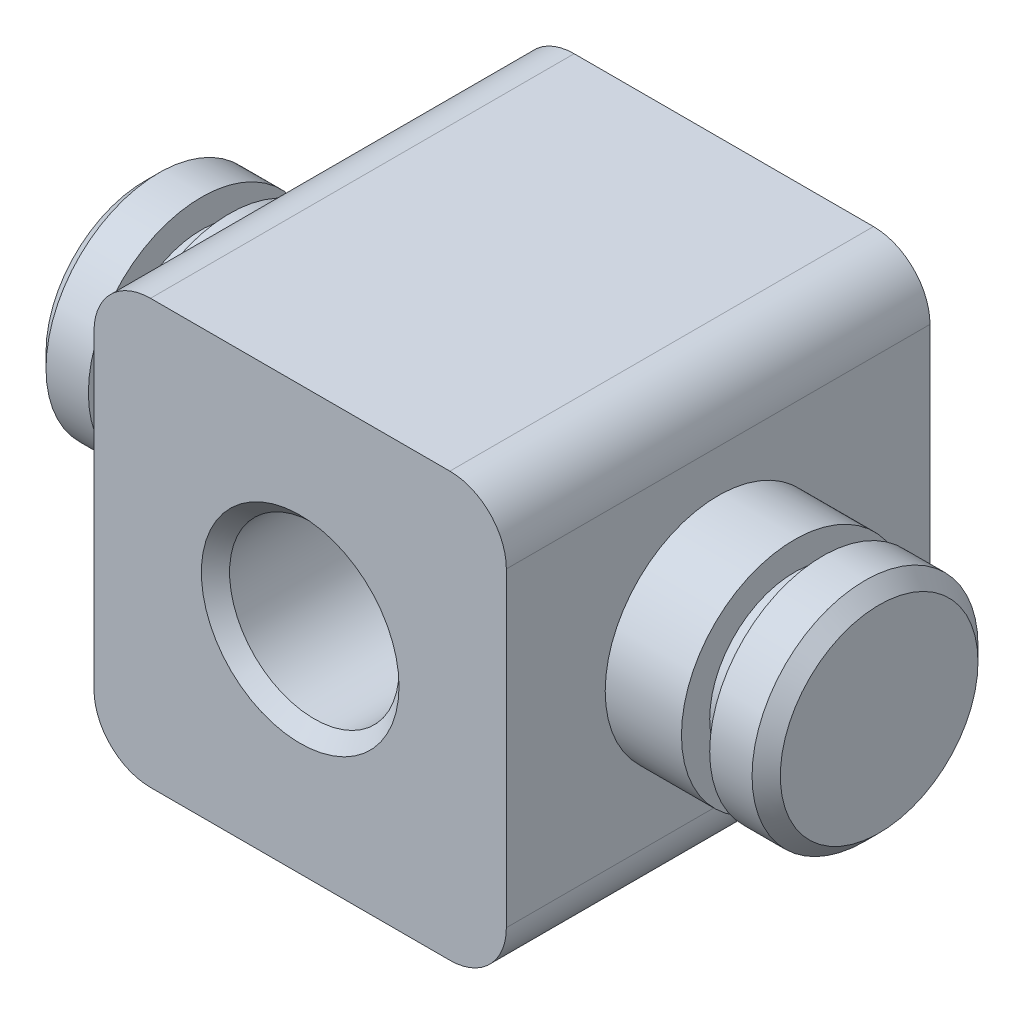
ISO-10303-21;
HEADER;
FILE_DESCRIPTION(('STEP AP214'),'2;1');
FILE_NAME('part.step','',(''),(''),'','','');
FILE_SCHEMA(('AUTOMOTIVE_DESIGN { 1 0 10303 214 1 1 1 1 }'));
ENDSEC;
DATA;
#1=APPLICATION_CONTEXT('core data for automotive mechanical design processes');
#2=APPLICATION_PROTOCOL_DEFINITION('international standard','automotive_design',2000,#1);
#3=PRODUCT_CONTEXT('',#1,'mechanical');
#4=PRODUCT('Part','Part','',(#3));
#5=PRODUCT_RELATED_PRODUCT_CATEGORY('part','',(#4));
#6=PRODUCT_DEFINITION_FORMATION('','',#4);
#7=PRODUCT_DEFINITION_CONTEXT('part definition',#1,'design');
#8=PRODUCT_DEFINITION('design','',#6,#7);
#9=PRODUCT_DEFINITION_SHAPE('','',#8);
#10=(LENGTH_UNIT() NAMED_UNIT(*) SI_UNIT(.MILLI.,.METRE.));
#11=(NAMED_UNIT(*) PLANE_ANGLE_UNIT() SI_UNIT($,.RADIAN.));
#12=(NAMED_UNIT(*) SI_UNIT($,.STERADIAN.) SOLID_ANGLE_UNIT());
#13=UNCERTAINTY_MEASURE_WITH_UNIT(LENGTH_MEASURE(1.E-05),#10,'distance_accuracy_value','');
#14=(GEOMETRIC_REPRESENTATION_CONTEXT(3) GLOBAL_UNCERTAINTY_ASSIGNED_CONTEXT((#13)) GLOBAL_UNIT_ASSIGNED_CONTEXT((#10,
#11,#12)) REPRESENTATION_CONTEXT('',''));
#15=CARTESIAN_POINT('',(0.,0.,0.));
#16=DIRECTION('',(0.,0.,1.));
#17=DIRECTION('',(1.,0.,0.));
#18=AXIS2_PLACEMENT_3D('',#15,#16,#17);
#19=CARTESIAN_POINT('',(5.3,-5.5,15.));
#20=DIRECTION('',(0.,0.,1.));
#21=DIRECTION('',(1.,0.,0.));
#22=AXIS2_PLACEMENT_3D('',#19,#20,#21);
#23=PLANE('',#22);
#24=CARTESIAN_POINT('',(0.,0.,15.));
#25=DIRECTION('',(0.,0.,1.));
#26=DIRECTION('',(1.,0.,0.));
#27=AXIS2_PLACEMENT_3D('',#24,#25,#26);
#28=CIRCLE('',#27,3.50000000000001);
#29=CARTESIAN_POINT('',(3.50000000000001,0.,15.));
#30=VERTEX_POINT('',#29);
#31=EDGE_CURVE('E11',#30,#30,#28,.F.);
#32=ORIENTED_EDGE('',*,*,#31,.T.);
#33=EDGE_LOOP('',(#32));
#34=FACE_BOUND('',#33,.T.);
#35=CARTESIAN_POINT('',(5.3,-5.5,15.));
#36=DIRECTION('',(0.,0.,1.));
#37=DIRECTION('',(1.,0.,0.));
#38=AXIS2_PLACEMENT_3D('',#35,#36,#37);
#39=CIRCLE('',#38,2.);
#40=CARTESIAN_POINT('',(5.29999999999999,-7.5,15.));
#41=VERTEX_POINT('',#40);
#42=CARTESIAN_POINT('',(7.3,-5.49999999999999,15.));
#43=VERTEX_POINT('',#42);
#44=EDGE_CURVE('E167',#41,#43,#39,.T.);
#45=ORIENTED_EDGE('',*,*,#44,.T.);
#46=DIRECTION('',(0.,1.,0.));
#47=VECTOR('',#46,1.);
#48=CARTESIAN_POINT('',(7.3,-5.49999999999999,15.));
#49=LINE('',#48,#47);
#50=CARTESIAN_POINT('',(7.3,5.49999999999999,15.));
#51=VERTEX_POINT('',#50);
#52=EDGE_CURVE('E104',#43,#51,#49,.T.);
#53=ORIENTED_EDGE('',*,*,#52,.T.);
#54=CARTESIAN_POINT('',(5.3,5.5,15.));
#55=DIRECTION('',(0.,0.,1.));
#56=DIRECTION('',(-1.,0.,0.));
#57=AXIS2_PLACEMENT_3D('',#54,#55,#56);
#58=CIRCLE('',#57,2.);
#59=CARTESIAN_POINT('',(5.29999999999999,7.5,15.));
#60=VERTEX_POINT('',#59);
#61=EDGE_CURVE('E353',#51,#60,#58,.T.);
#62=ORIENTED_EDGE('',*,*,#61,.T.);
#63=DIRECTION('',(-1.,0.,0.));
#64=VECTOR('',#63,1.);
#65=CARTESIAN_POINT('',(-5.29999999999999,7.5,15.));
#66=LINE('',#65,#64);
#67=CARTESIAN_POINT('',(-5.29999999999999,7.5,15.));
#68=VERTEX_POINT('',#67);
#69=EDGE_CURVE('E356',#60,#68,#66,.T.);
#70=ORIENTED_EDGE('',*,*,#69,.T.);
#71=CARTESIAN_POINT('',(-5.3,5.5,15.));
#72=DIRECTION('',(0.,0.,1.));
#73=DIRECTION('',(-1.,0.,0.));
#74=AXIS2_PLACEMENT_3D('',#71,#72,#73);
#75=CIRCLE('',#74,2.);
#76=CARTESIAN_POINT('',(-7.3,5.49999999999999,15.));
#77=VERTEX_POINT('',#76);
#78=EDGE_CURVE('E122',#68,#77,#75,.T.);
#79=ORIENTED_EDGE('',*,*,#78,.T.);
#80=DIRECTION('',(0.,-1.,0.));
#81=VECTOR('',#80,1.);
#82=CARTESIAN_POINT('',(-7.3,-5.49999999999999,15.));
#83=LINE('',#82,#81);
#84=CARTESIAN_POINT('',(-7.3,-5.5,15.));
#85=VERTEX_POINT('',#84);
#86=EDGE_CURVE('E117',#77,#85,#83,.T.);
#87=ORIENTED_EDGE('',*,*,#86,.T.);
#88=CARTESIAN_POINT('',(-5.3,-5.5,15.));
#89=DIRECTION('',(0.,0.,1.));
#90=DIRECTION('',(-1.,0.,0.));
#91=AXIS2_PLACEMENT_3D('',#88,#89,#90);
#92=CIRCLE('',#91,2.);
#93=CARTESIAN_POINT('',(-5.29999999999999,-7.5,15.));
#94=VERTEX_POINT('',#93);
#95=EDGE_CURVE('E120',#85,#94,#92,.T.);
#96=ORIENTED_EDGE('',*,*,#95,.T.);
#97=DIRECTION('',(1.,0.,0.));
#98=VECTOR('',#97,1.);
#99=CARTESIAN_POINT('',(-5.29999999999999,-7.5,15.));
#100=LINE('',#99,#98);
#101=EDGE_CURVE('E60',#94,#41,#100,.T.);
#102=ORIENTED_EDGE('',*,*,#101,.T.);
#103=EDGE_LOOP('',(#45,#53,#62,#70,#79,#87,#96,#102));
#104=FACE_BOUND('',#103,.T.);
#105=ADVANCED_FACE('F41',(#34,#104),#23,.T.);
#106=CARTESIAN_POINT('',(5.3,-5.5,0.));
#107=DIRECTION('',(0.,0.,1.));
#108=DIRECTION('',(1.,0.,0.));
#109=AXIS2_PLACEMENT_3D('',#106,#107,#108);
#110=PLANE('',#109);
#111=CARTESIAN_POINT('',(0.,0.,0.));
#112=DIRECTION('',(0.,0.,1.));
#113=DIRECTION('',(1.,0.,0.));
#114=AXIS2_PLACEMENT_3D('',#111,#112,#113);
#115=CIRCLE('',#114,3.5);
#116=CARTESIAN_POINT('',(3.49999999999999,0.,0.));
#117=VERTEX_POINT('',#116);
#118=EDGE_CURVE('E210',#117,#117,#115,.T.);
#119=ORIENTED_EDGE('',*,*,#118,.T.);
#120=EDGE_LOOP('',(#119));
#121=FACE_BOUND('',#120,.T.);
#122=CARTESIAN_POINT('',(5.3,-5.5,0.));
#123=DIRECTION('',(0.,0.,1.));
#124=DIRECTION('',(1.,0.,0.));
#125=AXIS2_PLACEMENT_3D('',#122,#123,#124);
#126=CIRCLE('',#125,2.);
#127=CARTESIAN_POINT('',(5.29999999999999,-7.5,0.));
#128=VERTEX_POINT('',#127);
#129=CARTESIAN_POINT('',(7.3,-5.49999999999999,0.));
#130=VERTEX_POINT('',#129);
#131=EDGE_CURVE('E144',#128,#130,#126,.T.);
#132=ORIENTED_EDGE('',*,*,#131,.F.);
#133=DIRECTION('',(1.,0.,0.));
#134=VECTOR('',#133,1.);
#135=CARTESIAN_POINT('',(-5.29999999999999,-7.5,0.));
#136=LINE('',#135,#134);
#137=CARTESIAN_POINT('',(-5.29999999999999,-7.5,0.));
#138=VERTEX_POINT('',#137);
#139=EDGE_CURVE('E95',#138,#128,#136,.T.);
#140=ORIENTED_EDGE('',*,*,#139,.F.);
#141=CARTESIAN_POINT('',(-5.3,-5.5,0.));
#142=DIRECTION('',(0.,0.,1.));
#143=DIRECTION('',(-1.,0.,0.));
#144=AXIS2_PLACEMENT_3D('',#141,#142,#143);
#145=CIRCLE('',#144,2.);
#146=CARTESIAN_POINT('',(-7.3,-5.5,0.));
#147=VERTEX_POINT('',#146);
#148=EDGE_CURVE('E89',#147,#138,#145,.T.);
#149=ORIENTED_EDGE('',*,*,#148,.F.);
#150=DIRECTION('',(0.,-1.,0.));
#151=VECTOR('',#150,1.);
#152=CARTESIAN_POINT('',(-7.3,-5.49999999999999,0.));
#153=LINE('',#152,#151);
#154=CARTESIAN_POINT('',(-7.3,5.49999999999999,0.));
#155=VERTEX_POINT('',#154);
#156=EDGE_CURVE('E131',#155,#147,#153,.T.);
#157=ORIENTED_EDGE('',*,*,#156,.F.);
#158=CARTESIAN_POINT('',(-5.3,5.5,0.));
#159=DIRECTION('',(0.,0.,1.));
#160=DIRECTION('',(-1.,0.,0.));
#161=AXIS2_PLACEMENT_3D('',#158,#159,#160);
#162=CIRCLE('',#161,2.);
#163=CARTESIAN_POINT('',(-5.29999999999999,7.5,0.));
#164=VERTEX_POINT('',#163);
#165=EDGE_CURVE('E158',#164,#155,#162,.T.);
#166=ORIENTED_EDGE('',*,*,#165,.F.);
#167=DIRECTION('',(-1.,0.,0.));
#168=VECTOR('',#167,1.);
#169=CARTESIAN_POINT('',(-5.29999999999999,7.5,0.));
#170=LINE('',#169,#168);
#171=CARTESIAN_POINT('',(5.29999999999999,7.5,0.));
#172=VERTEX_POINT('',#171);
#173=EDGE_CURVE('E155',#172,#164,#170,.T.);
#174=ORIENTED_EDGE('',*,*,#173,.F.);
#175=CARTESIAN_POINT('',(5.3,5.5,0.));
#176=DIRECTION('',(0.,0.,1.));
#177=DIRECTION('',(-1.,0.,0.));
#178=AXIS2_PLACEMENT_3D('',#175,#176,#177);
#179=CIRCLE('',#178,2.);
#180=CARTESIAN_POINT('',(7.3,5.49999999999999,0.));
#181=VERTEX_POINT('',#180);
#182=EDGE_CURVE('E152',#181,#172,#179,.T.);
#183=ORIENTED_EDGE('',*,*,#182,.F.);
#184=DIRECTION('',(0.,1.,0.));
#185=VECTOR('',#184,1.);
#186=CARTESIAN_POINT('',(7.3,-5.49999999999999,0.));
#187=LINE('',#186,#185);
#188=EDGE_CURVE('E148',#130,#181,#187,.T.);
#189=ORIENTED_EDGE('',*,*,#188,.F.);
#190=EDGE_LOOP('',(#132,#140,#149,#157,#166,#174,#183,#189));
#191=FACE_BOUND('',#190,.T.);
#192=ADVANCED_FACE('F230',(#121,#191),#110,.F.);
#193=CARTESIAN_POINT('',(5.3,-5.5,15.));
#194=DIRECTION('',(0.,0.,-1.));
#195=DIRECTION('',(-1.,0.,0.));
#196=AXIS2_PLACEMENT_3D('',#193,#194,#195);
#197=CYLINDRICAL_SURFACE('',#196,2.);
#198=ORIENTED_EDGE('',*,*,#131,.T.);
#199=DIRECTION('',(0.,0.,-1.));
#200=VECTOR('',#199,1.);
#201=CARTESIAN_POINT('',(7.3,-5.49999999999999,15.));
#202=LINE('',#201,#200);
#203=EDGE_CURVE('E186',#43,#130,#202,.T.);
#204=ORIENTED_EDGE('',*,*,#203,.F.);
#205=ORIENTED_EDGE('',*,*,#44,.F.);
#206=DIRECTION('',(0.,0.,-1.));
#207=VECTOR('',#206,1.);
#208=CARTESIAN_POINT('',(5.29999999999999,-7.5,15.));
#209=LINE('',#208,#207);
#210=EDGE_CURVE('E140',#41,#128,#209,.T.);
#211=ORIENTED_EDGE('',*,*,#210,.T.);
#212=EDGE_LOOP('',(#198,#204,#205,#211));
#213=FACE_BOUND('',#212,.T.);
#214=ADVANCED_FACE('F233',(#213),#197,.T.);
#215=CARTESIAN_POINT('',(7.3,-5.49999999999999,15.));
#216=DIRECTION('',(-1.,0.,0.));
#217=DIRECTION('',(0.,0.,1.));
#218=AXIS2_PLACEMENT_3D('',#215,#216,#217);
#219=PLANE('',#218);
#220=CARTESIAN_POINT('',(7.3,0.,7.5));
#221=DIRECTION('',(-1.,0.,0.));
#222=DIRECTION('',(0.,0.,1.));
#223=AXIS2_PLACEMENT_3D('',#220,#221,#222);
#224=CIRCLE('',#223,4.);
#225=CARTESIAN_POINT('',(7.3,0.,11.5));
#226=VERTEX_POINT('',#225);
#227=EDGE_CURVE('E327',#226,#226,#224,.T.);
#228=ORIENTED_EDGE('',*,*,#227,.T.);
#229=EDGE_LOOP('',(#228));
#230=FACE_BOUND('',#229,.T.);
#231=ORIENTED_EDGE('',*,*,#188,.T.);
#232=DIRECTION('',(0.,0.,-1.));
#233=VECTOR('',#232,1.);
#234=CARTESIAN_POINT('',(7.3,5.49999999999999,15.));
#235=LINE('',#234,#233);
#236=EDGE_CURVE('E182',#51,#181,#235,.T.);
#237=ORIENTED_EDGE('',*,*,#236,.F.);
#238=ORIENTED_EDGE('',*,*,#52,.F.);
#239=ORIENTED_EDGE('',*,*,#203,.T.);
#240=EDGE_LOOP('',(#231,#237,#238,#239));
#241=FACE_BOUND('',#240,.T.);
#242=ADVANCED_FACE('F371',(#230,#241),#219,.F.);
#243=CARTESIAN_POINT('',(5.3,5.5,15.));
#244=DIRECTION('',(0.,0.,-1.));
#245=DIRECTION('',(-1.,0.,0.));
#246=AXIS2_PLACEMENT_3D('',#243,#244,#245);
#247=CYLINDRICAL_SURFACE('',#246,2.);
#248=ORIENTED_EDGE('',*,*,#182,.T.);
#249=DIRECTION('',(0.,0.,-1.));
#250=VECTOR('',#249,1.);
#251=CARTESIAN_POINT('',(5.29999999999999,7.5,15.));
#252=LINE('',#251,#250);
#253=EDGE_CURVE('E178',#60,#172,#252,.T.);
#254=ORIENTED_EDGE('',*,*,#253,.F.);
#255=ORIENTED_EDGE('',*,*,#61,.F.);
#256=ORIENTED_EDGE('',*,*,#236,.T.);
#257=EDGE_LOOP('',(#248,#254,#255,#256));
#258=FACE_BOUND('',#257,.T.);
#259=ADVANCED_FACE('F370',(#258),#247,.T.);
#260=CARTESIAN_POINT('',(-5.29999999999999,7.5,15.));
#261=DIRECTION('',(0.,-1.,0.));
#262=DIRECTION('',(0.,0.,-1.));
#263=AXIS2_PLACEMENT_3D('',#260,#261,#262);
#264=PLANE('',#263);
#265=ORIENTED_EDGE('',*,*,#173,.T.);
#266=DIRECTION('',(0.,0.,-1.));
#267=VECTOR('',#266,1.);
#268=CARTESIAN_POINT('',(-5.29999999999999,7.5,15.));
#269=LINE('',#268,#267);
#270=EDGE_CURVE('E174',#68,#164,#269,.T.);
#271=ORIENTED_EDGE('',*,*,#270,.F.);
#272=ORIENTED_EDGE('',*,*,#69,.F.);
#273=ORIENTED_EDGE('',*,*,#253,.T.);
#274=EDGE_LOOP('',(#265,#271,#272,#273));
#275=FACE_BOUND('',#274,.T.);
#276=ADVANCED_FACE('F364',(#275),#264,.F.);
#277=CARTESIAN_POINT('',(-5.3,5.5,15.));
#278=DIRECTION('',(0.,0.,-1.));
#279=DIRECTION('',(-1.,0.,0.));
#280=AXIS2_PLACEMENT_3D('',#277,#278,#279);
#281=CYLINDRICAL_SURFACE('',#280,2.);
#282=ORIENTED_EDGE('',*,*,#165,.T.);
#283=DIRECTION('',(0.,0.,-1.));
#284=VECTOR('',#283,1.);
#285=CARTESIAN_POINT('',(-7.3,5.49999999999999,15.));
#286=LINE('',#285,#284);
#287=EDGE_CURVE('E133',#77,#155,#286,.T.);
#288=ORIENTED_EDGE('',*,*,#287,.F.);
#289=ORIENTED_EDGE('',*,*,#78,.F.);
#290=ORIENTED_EDGE('',*,*,#270,.T.);
#291=EDGE_LOOP('',(#282,#288,#289,#290));
#292=FACE_BOUND('',#291,.T.);
#293=ADVANCED_FACE('F368',(#292),#281,.T.);
#294=CARTESIAN_POINT('',(-7.3,-5.49999999999999,15.));
#295=DIRECTION('',(1.,0.,0.));
#296=DIRECTION('',(0.,0.,-1.));
#297=AXIS2_PLACEMENT_3D('',#294,#295,#296);
#298=PLANE('',#297);
#299=CARTESIAN_POINT('',(-7.3,0.,7.5));
#300=DIRECTION('',(1.,0.,0.));
#301=DIRECTION('',(0.,0.,-1.));
#302=AXIS2_PLACEMENT_3D('',#299,#300,#301);
#303=CIRCLE('',#302,4.);
#304=CARTESIAN_POINT('',(-7.3,0.,3.5));
#305=VERTEX_POINT('',#304);
#306=EDGE_CURVE('E189',#305,#305,#303,.F.);
#307=ORIENTED_EDGE('',*,*,#306,.F.);
#308=EDGE_LOOP('',(#307));
#309=FACE_BOUND('',#308,.T.);
#310=ORIENTED_EDGE('',*,*,#156,.T.);
#311=DIRECTION('',(0.,0.,-1.));
#312=VECTOR('',#311,1.);
#313=CARTESIAN_POINT('',(-7.3,-5.5,15.));
#314=LINE('',#313,#312);
#315=EDGE_CURVE('E128',#85,#147,#314,.T.);
#316=ORIENTED_EDGE('',*,*,#315,.F.);
#317=ORIENTED_EDGE('',*,*,#86,.F.);
#318=ORIENTED_EDGE('',*,*,#287,.T.);
#319=EDGE_LOOP('',(#310,#316,#317,#318));
#320=FACE_BOUND('',#319,.T.);
#321=ADVANCED_FACE('F129',(#309,#320),#298,.F.);
#322=CARTESIAN_POINT('',(-5.3,-5.5,15.));
#323=DIRECTION('',(0.,0.,-1.));
#324=DIRECTION('',(-1.,0.,0.));
#325=AXIS2_PLACEMENT_3D('',#322,#323,#324);
#326=CYLINDRICAL_SURFACE('',#325,2.);
#327=ORIENTED_EDGE('',*,*,#148,.T.);
#328=DIRECTION('',(0.,0.,-1.));
#329=VECTOR('',#328,1.);
#330=CARTESIAN_POINT('',(-5.29999999999999,-7.5,15.));
#331=LINE('',#330,#329);
#332=EDGE_CURVE('E134',#94,#138,#331,.T.);
#333=ORIENTED_EDGE('',*,*,#332,.F.);
#334=ORIENTED_EDGE('',*,*,#95,.F.);
#335=ORIENTED_EDGE('',*,*,#315,.T.);
#336=EDGE_LOOP('',(#327,#333,#334,#335));
#337=FACE_BOUND('',#336,.T.);
#338=ADVANCED_FACE('F136',(#337),#326,.T.);
#339=CARTESIAN_POINT('',(-5.29999999999999,-7.5,15.));
#340=DIRECTION('',(0.,1.,0.));
#341=DIRECTION('',(0.,0.,1.));
#342=AXIS2_PLACEMENT_3D('',#339,#340,#341);
#343=PLANE('',#342);
#344=ORIENTED_EDGE('',*,*,#139,.T.);
#345=ORIENTED_EDGE('',*,*,#210,.F.);
#346=ORIENTED_EDGE('',*,*,#101,.F.);
#347=ORIENTED_EDGE('',*,*,#332,.T.);
#348=EDGE_LOOP('',(#344,#345,#346,#347));
#349=FACE_BOUND('',#348,.T.);
#350=ADVANCED_FACE('F240',(#349),#343,.F.);
#351=CARTESIAN_POINT('',(0.,0.,15.));
#352=DIRECTION('',(0.,0.,-1.));
#353=DIRECTION('',(-1.,0.,0.));
#354=AXIS2_PLACEMENT_3D('',#351,#352,#353);
#355=CYLINDRICAL_SURFACE('',#354,3.);
#356=CARTESIAN_POINT('',(0.,0.,0.500000000000002));
#357=DIRECTION('',(0.,0.,1.));
#358=DIRECTION('',(1.,0.,0.));
#359=AXIS2_PLACEMENT_3D('',#356,#357,#358);
#360=CIRCLE('',#359,3.);
#361=CARTESIAN_POINT('',(3.,0.,0.500000000000002));
#362=VERTEX_POINT('',#361);
#363=EDGE_CURVE('E52',#362,#362,#360,.F.);
#364=ORIENTED_EDGE('',*,*,#363,.T.);
#365=EDGE_LOOP('',(#364));
#366=FACE_BOUND('',#365,.T.);
#367=CARTESIAN_POINT('',(0.,0.,14.5));
#368=DIRECTION('',(0.,0.,1.));
#369=DIRECTION('',(1.,0.,0.));
#370=AXIS2_PLACEMENT_3D('',#367,#368,#369);
#371=CIRCLE('',#370,3.);
#372=CARTESIAN_POINT('',(3.,0.,14.5));
#373=VERTEX_POINT('',#372);
#374=EDGE_CURVE('E214',#373,#373,#371,.T.);
#375=ORIENTED_EDGE('',*,*,#374,.T.);
#376=EDGE_LOOP('',(#375));
#377=FACE_BOUND('',#376,.T.);
#378=ADVANCED_FACE('F221',(#366,#377),#355,.F.);
#379=CARTESIAN_POINT('',(-10.,0.,7.5));
#380=DIRECTION('',(1.,0.,0.));
#381=DIRECTION('',(0.,0.,-1.));
#382=AXIS2_PLACEMENT_3D('',#379,#380,#381);
#383=CYLINDRICAL_SURFACE('',#382,4.);
#384=CARTESIAN_POINT('',(-10.,0.,7.5));
#385=DIRECTION('',(-1.,0.,0.));
#386=DIRECTION('',(0.,0.,1.));
#387=AXIS2_PLACEMENT_3D('',#384,#385,#386);
#388=CIRCLE('',#387,4.);
#389=CARTESIAN_POINT('',(-10.,0.,3.5));
#390=VERTEX_POINT('',#389);
#391=EDGE_CURVE('E149',#390,#390,#388,.T.);
#392=CARTESIAN_POINT('',(-10.,0.,3.5));
#393=CARTESIAN_POINT('',(-9.971875,0.,3.5));
#394=CARTESIAN_POINT('',(-9.94375,0.,3.5));
#395=CARTESIAN_POINT('',(-9.8875,0.,3.5));
#396=CARTESIAN_POINT('',(-9.859375,0.,3.5));
#397=CARTESIAN_POINT('',(-9.803125,0.,3.5));
#398=CARTESIAN_POINT('',(-9.775,0.,3.5));
#399=CARTESIAN_POINT('',(-9.71875,0.,3.5));
#400=CARTESIAN_POINT('',(-9.690625,0.,3.5));
#401=CARTESIAN_POINT('',(-9.634375,0.,3.5));
#402=CARTESIAN_POINT('',(-9.60625,0.,3.5));
#403=CARTESIAN_POINT('',(-9.55,0.,3.5));
#404=CARTESIAN_POINT('',(-9.521875,0.,3.5));
#405=CARTESIAN_POINT('',(-9.465625,0.,3.5));
#406=CARTESIAN_POINT('',(-9.4375,0.,3.5));
#407=CARTESIAN_POINT('',(-9.38125,0.,3.5));
#408=CARTESIAN_POINT('',(-9.353125,0.,3.5));
#409=CARTESIAN_POINT('',(-9.296875,0.,3.5));
#410=CARTESIAN_POINT('',(-9.26875,0.,3.5));
#411=CARTESIAN_POINT('',(-9.2125,0.,3.5));
#412=CARTESIAN_POINT('',(-9.184375,0.,3.5));
#413=CARTESIAN_POINT('',(-9.128125,0.,3.5));
#414=CARTESIAN_POINT('',(-9.1,0.,3.5));
#415=CARTESIAN_POINT('',(-9.04375,0.,3.5));
#416=CARTESIAN_POINT('',(-9.015625,0.,3.5));
#417=CARTESIAN_POINT('',(-8.959375,0.,3.5));
#418=CARTESIAN_POINT('',(-8.93125,0.,3.5));
#419=CARTESIAN_POINT('',(-8.875,0.,3.5));
#420=CARTESIAN_POINT('',(-8.846875,0.,3.5));
#421=CARTESIAN_POINT('',(-8.790625,0.,3.5));
#422=CARTESIAN_POINT('',(-8.7625,0.,3.5));
#423=CARTESIAN_POINT('',(-8.70625,0.,3.5));
#424=CARTESIAN_POINT('',(-8.678125,0.,3.5));
#425=CARTESIAN_POINT('',(-8.621875,0.,3.5));
#426=CARTESIAN_POINT('',(-8.59375,0.,3.5));
#427=CARTESIAN_POINT('',(-8.5375,0.,3.5));
#428=CARTESIAN_POINT('',(-8.509375,0.,3.5));
#429=CARTESIAN_POINT('',(-8.453125,0.,3.5));
#430=CARTESIAN_POINT('',(-8.425,0.,3.5));
#431=CARTESIAN_POINT('',(-8.36875,0.,3.5));
#432=CARTESIAN_POINT('',(-8.340625,0.,3.5));
#433=CARTESIAN_POINT('',(-8.284375,0.,3.5));
#434=CARTESIAN_POINT('',(-8.25625,0.,3.5));
#435=CARTESIAN_POINT('',(-8.2,0.,3.5));
#436=CARTESIAN_POINT('',(-8.171875,0.,3.5));
#437=CARTESIAN_POINT('',(-8.115625,0.,3.5));
#438=CARTESIAN_POINT('',(-8.0875,0.,3.5));
#439=CARTESIAN_POINT('',(-8.03125,0.,3.5));
#440=CARTESIAN_POINT('',(-8.003125,0.,3.5));
#441=CARTESIAN_POINT('',(-7.946875,0.,3.5));
#442=CARTESIAN_POINT('',(-7.91875,0.,3.5));
#443=CARTESIAN_POINT('',(-7.8625,0.,3.5));
#444=CARTESIAN_POINT('',(-7.834375,0.,3.5));
#445=CARTESIAN_POINT('',(-7.778125,0.,3.5));
#446=CARTESIAN_POINT('',(-7.75,0.,3.5));
#447=CARTESIAN_POINT('',(-7.69375,0.,3.5));
#448=CARTESIAN_POINT('',(-7.665625,0.,3.5));
#449=CARTESIAN_POINT('',(-7.609375,0.,3.5));
#450=CARTESIAN_POINT('',(-7.58125,0.,3.5));
#451=CARTESIAN_POINT('',(-7.525,0.,3.5));
#452=CARTESIAN_POINT('',(-7.496875,0.,3.5));
#453=CARTESIAN_POINT('',(-7.440625,0.,3.5));
#454=CARTESIAN_POINT('',(-7.4125,0.,3.5));
#455=CARTESIAN_POINT('',(-7.35625,0.,3.5));
#456=CARTESIAN_POINT('',(-7.328125,0.,3.5));
#457=CARTESIAN_POINT('',(-7.3,0.,3.5));
#458=B_SPLINE_CURVE_WITH_KNOTS('',3,(#392,#393,#394,#395,#396,#397,#398,#399,#400,#401,#402,
#403,#404,#405,#406,#407,#408,#409,#410,#411,#412,#413,#414,#415,#416,#417,#418,#419,#420,#421,
#422,#423,#424,#425,#426,#427,#428,#429,#430,#431,#432,#433,#434,#435,#436,#437,#438,#439,#440,
#441,#442,#443,#444,#445,#446,#447,#448,#449,#450,#451,#452,#453,#454,#455,#456,#457),
.UNSPECIFIED.,.F.,.F.,(4,2,2,2,2,2,2,2,2,2,2,2,2,2,2,2,2,2,2,2,2,2,2,2,2,2,2,2,2,2,2,2,4),(0.,
0.0843750000000011,0.168750000000001,0.253125000000002,0.337500000000001,0.421875,
0.506250000000002,0.590625000000001,0.675,0.759375000000001,0.843750000000001,0.928125,1.0125,
1.096875,1.18125,1.265625,1.35,1.434375,1.51875,1.603125,1.6875,1.771875,1.85625,1.940625,2.025,
2.109375,2.19375,2.278125,2.3625,2.446875,2.53125,2.615625,2.7),.UNSPECIFIED.);
#459=EDGE_CURVE('BSEAM247',#390,#305,#458,.T.);
#460=ORIENTED_EDGE('',*,*,#391,.F.);
#461=ORIENTED_EDGE('',*,*,#306,.T.);
#462=ORIENTED_EDGE('',*,*,#459,.T.);
#463=ORIENTED_EDGE('',*,*,#459,.F.);
#464=EDGE_LOOP('',(#460,#462,#461,#463));
#465=FACE_BOUND('',#464,.T.);
#466=ADVANCED_FACE('F247',(#465),#383,.T.);
#467=CARTESIAN_POINT('',(-10.,0.,7.5));
#468=DIRECTION('',(-1.,0.,0.));
#469=DIRECTION('',(0.,0.,1.));
#470=AXIS2_PLACEMENT_3D('',#467,#468,#469);
#471=PLANE('',#470);
#472=CARTESIAN_POINT('',(-10.,0.,7.5));
#473=DIRECTION('',(-1.,0.,0.));
#474=DIRECTION('',(0.,0.,1.));
#475=AXIS2_PLACEMENT_3D('',#472,#473,#474);
#476=CIRCLE('',#475,3.);
#477=CARTESIAN_POINT('',(-10.,0.,10.5));
#478=VERTEX_POINT('',#477);
#479=EDGE_CURVE('E193',#478,#478,#476,.T.);
#480=ORIENTED_EDGE('',*,*,#479,.F.);
#481=EDGE_LOOP('',(#480));
#482=FACE_BOUND('',#481,.T.);
#483=ORIENTED_EDGE('',*,*,#391,.T.);
#484=EDGE_LOOP('',(#483));
#485=FACE_BOUND('',#484,.T.);
#486=ADVANCED_FACE('F258',(#482,#485),#471,.T.);
#487=CARTESIAN_POINT('',(-11.,0.,7.5));
#488=DIRECTION('',(1.,0.,0.));
#489=DIRECTION('',(0.,0.,-1.));
#490=AXIS2_PLACEMENT_3D('',#487,#488,#489);
#491=CYLINDRICAL_SURFACE('',#490,3.);
#492=CARTESIAN_POINT('',(-11.,0.,7.5));
#493=DIRECTION('',(-1.,0.,0.));
#494=DIRECTION('',(0.,0.,1.));
#495=AXIS2_PLACEMENT_3D('',#492,#493,#494);
#496=CIRCLE('',#495,3.);
#497=CARTESIAN_POINT('',(-11.,0.,10.5));
#498=VERTEX_POINT('',#497);
#499=EDGE_CURVE('E339',#498,#498,#496,.T.);
#500=ORIENTED_EDGE('',*,*,#499,.F.);
#501=EDGE_LOOP('',(#500));
#502=FACE_BOUND('',#501,.T.);
#503=ORIENTED_EDGE('',*,*,#479,.T.);
#504=EDGE_LOOP('',(#503));
#505=FACE_BOUND('',#504,.T.);
#506=ADVANCED_FACE('F262',(#502,#505),#491,.T.);
#507=CARTESIAN_POINT('',(-13.,0.,7.5));
#508=DIRECTION('',(1.,0.,0.));
#509=DIRECTION('',(0.,0.,-1.));
#510=AXIS2_PLACEMENT_3D('',#507,#508,#509);
#511=CYLINDRICAL_SURFACE('',#510,4.);
#512=CARTESIAN_POINT('',(-12.5,0.,7.5));
#513=DIRECTION('',(-1.,0.,0.));
#514=DIRECTION('',(0.,0.,1.));
#515=AXIS2_PLACEMENT_3D('',#512,#513,#514);
#516=CIRCLE('',#515,4.);
#517=CARTESIAN_POINT('',(-12.5,0.,11.5));
#518=VERTEX_POINT('',#517);
#519=EDGE_CURVE('E198',#518,#518,#516,.F.);
#520=ORIENTED_EDGE('',*,*,#519,.T.);
#521=EDGE_LOOP('',(#520));
#522=FACE_BOUND('',#521,.T.);
#523=CARTESIAN_POINT('',(-11.,0.,7.5));
#524=DIRECTION('',(-1.,0.,0.));
#525=DIRECTION('',(0.,0.,1.));
#526=AXIS2_PLACEMENT_3D('',#523,#524,#525);
#527=CIRCLE('',#526,4.);
#528=CARTESIAN_POINT('',(-11.,0.,11.5));
#529=VERTEX_POINT('',#528);
#530=EDGE_CURVE('E332',#529,#529,#527,.T.);
#531=ORIENTED_EDGE('',*,*,#530,.T.);
#532=EDGE_LOOP('',(#531));
#533=FACE_BOUND('',#532,.T.);
#534=ADVANCED_FACE('F266',(#522,#533),#511,.T.);
#535=CARTESIAN_POINT('',(-13.,0.,7.5));
#536=DIRECTION('',(-1.,0.,0.));
#537=DIRECTION('',(0.,0.,1.));
#538=AXIS2_PLACEMENT_3D('',#535,#536,#537);
#539=PLANE('',#538);
#540=CARTESIAN_POINT('',(-13.,0.,7.5));
#541=DIRECTION('',(-1.,0.,0.));
#542=DIRECTION('',(0.,0.,1.));
#543=AXIS2_PLACEMENT_3D('',#540,#541,#542);
#544=CIRCLE('',#543,3.50000000000001);
#545=CARTESIAN_POINT('',(-13.,0.,11.));
#546=VERTEX_POINT('',#545);
#547=EDGE_CURVE('E194',#546,#546,#544,.T.);
#548=ORIENTED_EDGE('',*,*,#547,.T.);
#549=EDGE_LOOP('',(#548));
#550=FACE_BOUND('',#549,.T.);
#551=ADVANCED_FACE('F270',(#550),#539,.T.);
#552=CARTESIAN_POINT('',(-11.,0.,7.5));
#553=DIRECTION('',(-1.,0.,0.));
#554=DIRECTION('',(0.,0.,1.));
#555=AXIS2_PLACEMENT_3D('',#552,#553,#554);
#556=PLANE('',#555);
#557=ORIENTED_EDGE('',*,*,#499,.T.);
#558=EDGE_LOOP('',(#557));
#559=FACE_BOUND('',#558,.T.);
#560=ORIENTED_EDGE('',*,*,#530,.F.);
#561=EDGE_LOOP('',(#560));
#562=FACE_BOUND('',#561,.T.);
#563=ADVANCED_FACE('F272',(#559,#562),#556,.F.);
#564=CARTESIAN_POINT('',(-13.,0.,7.5));
#565=DIRECTION('',(1.,0.,0.));
#566=DIRECTION('',(0.,0.,-1.));
#567=AXIS2_PLACEMENT_3D('',#564,#565,#566);
#568=CONICAL_SURFACE('',#567,3.50000000000001,0.785398163397451);
#569=ORIENTED_EDGE('',*,*,#519,.F.);
#570=EDGE_LOOP('',(#569));
#571=FACE_BOUND('',#570,.T.);
#572=ORIENTED_EDGE('',*,*,#547,.F.);
#573=EDGE_LOOP('',(#572));
#574=FACE_BOUND('',#573,.T.);
#575=ADVANCED_FACE('F275',(#571,#574),#568,.T.);
#576=CARTESIAN_POINT('',(10.,0.,7.5));
#577=DIRECTION('',(-1.,0.,0.));
#578=DIRECTION('',(0.,0.,1.));
#579=AXIS2_PLACEMENT_3D('',#576,#577,#578);
#580=CYLINDRICAL_SURFACE('',#579,4.);
#581=CARTESIAN_POINT('',(10.,0.,7.5));
#582=DIRECTION('',(-1.,0.,0.));
#583=DIRECTION('',(0.,0.,1.));
#584=AXIS2_PLACEMENT_3D('',#581,#582,#583);
#585=CIRCLE('',#584,4.);
#586=CARTESIAN_POINT('',(10.,0.,11.5));
#587=VERTEX_POINT('',#586);
#588=EDGE_CURVE('E328',#587,#587,#585,.T.);
#589=CARTESIAN_POINT('',(10.,0.,11.5));
#590=CARTESIAN_POINT('',(9.971875,0.,11.5));
#591=CARTESIAN_POINT('',(9.94375,0.,11.5));
#592=CARTESIAN_POINT('',(9.8875,0.,11.5));
#593=CARTESIAN_POINT('',(9.859375,0.,11.5));
#594=CARTESIAN_POINT('',(9.803125,0.,11.5));
#595=CARTESIAN_POINT('',(9.775,0.,11.5));
#596=CARTESIAN_POINT('',(9.71875,0.,11.5));
#597=CARTESIAN_POINT('',(9.690625,0.,11.5));
#598=CARTESIAN_POINT('',(9.634375,0.,11.5));
#599=CARTESIAN_POINT('',(9.60625,0.,11.5));
#600=CARTESIAN_POINT('',(9.55,0.,11.5));
#601=CARTESIAN_POINT('',(9.521875,0.,11.5));
#602=CARTESIAN_POINT('',(9.465625,0.,11.5));
#603=CARTESIAN_POINT('',(9.4375,0.,11.5));
#604=CARTESIAN_POINT('',(9.38125,0.,11.5));
#605=CARTESIAN_POINT('',(9.353125,0.,11.5));
#606=CARTESIAN_POINT('',(9.296875,0.,11.5));
#607=CARTESIAN_POINT('',(9.26875,0.,11.5));
#608=CARTESIAN_POINT('',(9.2125,0.,11.5));
#609=CARTESIAN_POINT('',(9.184375,0.,11.5));
#610=CARTESIAN_POINT('',(9.128125,0.,11.5));
#611=CARTESIAN_POINT('',(9.1,0.,11.5));
#612=CARTESIAN_POINT('',(9.04375,0.,11.5));
#613=CARTESIAN_POINT('',(9.015625,0.,11.5));
#614=CARTESIAN_POINT('',(8.959375,0.,11.5));
#615=CARTESIAN_POINT('',(8.93125,0.,11.5));
#616=CARTESIAN_POINT('',(8.875,0.,11.5));
#617=CARTESIAN_POINT('',(8.846875,0.,11.5));
#618=CARTESIAN_POINT('',(8.790625,0.,11.5));
#619=CARTESIAN_POINT('',(8.7625,0.,11.5));
#620=CARTESIAN_POINT('',(8.70625,0.,11.5));
#621=CARTESIAN_POINT('',(8.678125,0.,11.5));
#622=CARTESIAN_POINT('',(8.621875,0.,11.5));
#623=CARTESIAN_POINT('',(8.59375,0.,11.5));
#624=CARTESIAN_POINT('',(8.5375,0.,11.5));
#625=CARTESIAN_POINT('',(8.509375,0.,11.5));
#626=CARTESIAN_POINT('',(8.453125,0.,11.5));
#627=CARTESIAN_POINT('',(8.425,0.,11.5));
#628=CARTESIAN_POINT('',(8.36875,0.,11.5));
#629=CARTESIAN_POINT('',(8.340625,0.,11.5));
#630=CARTESIAN_POINT('',(8.284375,0.,11.5));
#631=CARTESIAN_POINT('',(8.25625,0.,11.5));
#632=CARTESIAN_POINT('',(8.2,0.,11.5));
#633=CARTESIAN_POINT('',(8.171875,0.,11.5));
#634=CARTESIAN_POINT('',(8.115625,0.,11.5));
#635=CARTESIAN_POINT('',(8.0875,0.,11.5));
#636=CARTESIAN_POINT('',(8.03125,0.,11.5));
#637=CARTESIAN_POINT('',(8.003125,0.,11.5));
#638=CARTESIAN_POINT('',(7.946875,0.,11.5));
#639=CARTESIAN_POINT('',(7.91875,0.,11.5));
#640=CARTESIAN_POINT('',(7.8625,0.,11.5));
#641=CARTESIAN_POINT('',(7.834375,0.,11.5));
#642=CARTESIAN_POINT('',(7.778125,0.,11.5));
#643=CARTESIAN_POINT('',(7.75,0.,11.5));
#644=CARTESIAN_POINT('',(7.69375,0.,11.5));
#645=CARTESIAN_POINT('',(7.665625,0.,11.5));
#646=CARTESIAN_POINT('',(7.609375,0.,11.5));
#647=CARTESIAN_POINT('',(7.58125,0.,11.5));
#648=CARTESIAN_POINT('',(7.525,0.,11.5));
#649=CARTESIAN_POINT('',(7.496875,0.,11.5));
#650=CARTESIAN_POINT('',(7.440625,0.,11.5));
#651=CARTESIAN_POINT('',(7.4125,0.,11.5));
#652=CARTESIAN_POINT('',(7.35625,0.,11.5));
#653=CARTESIAN_POINT('',(7.328125,0.,11.5));
#654=CARTESIAN_POINT('',(7.3,0.,11.5));
#655=B_SPLINE_CURVE_WITH_KNOTS('',3,(#589,#590,#591,#592,#593,#594,#595,#596,#597,#598,#599,
#600,#601,#602,#603,#604,#605,#606,#607,#608,#609,#610,#611,#612,#613,#614,#615,#616,#617,#618,
#619,#620,#621,#622,#623,#624,#625,#626,#627,#628,#629,#630,#631,#632,#633,#634,#635,#636,#637,
#638,#639,#640,#641,#642,#643,#644,#645,#646,#647,#648,#649,#650,#651,#652,#653,#654),
.UNSPECIFIED.,.F.,.F.,(4,2,2,2,2,2,2,2,2,2,2,2,2,2,2,2,2,2,2,2,2,2,2,2,2,2,2,2,2,2,2,2,4),(0.,
0.0843750000000011,0.168750000000001,0.253125000000002,0.337500000000001,0.421875,
0.506250000000002,0.590625000000001,0.675000000000002,0.759375000000001,0.843750000000001,
0.928125000000002,1.0125,1.096875,1.18125,1.265625,1.35,1.434375,1.51875,1.603125,1.6875,
1.771875,1.85625,1.940625,2.025,2.109375,2.19375,2.278125,2.3625,2.446875,2.53125,2.615625,2.7),.UNSPECIFIED.);
#656=EDGE_CURVE('BSEAM280',#587,#226,#655,.T.);
#657=ORIENTED_EDGE('',*,*,#588,.T.);
#658=ORIENTED_EDGE('',*,*,#227,.F.);
#659=ORIENTED_EDGE('',*,*,#656,.T.);
#660=ORIENTED_EDGE('',*,*,#656,.F.);
#661=EDGE_LOOP('',(#657,#659,#658,#660));
#662=FACE_BOUND('',#661,.T.);
#663=ADVANCED_FACE('F280',(#662),#580,.T.);
#664=CARTESIAN_POINT('',(10.,0.,7.5));
#665=DIRECTION('',(1.,0.,0.));
#666=DIRECTION('',(0.,0.,1.));
#667=AXIS2_PLACEMENT_3D('',#664,#665,#666);
#668=PLANE('',#667);
#669=CARTESIAN_POINT('',(10.,0.,7.5));
#670=DIRECTION('',(-1.,0.,0.));
#671=DIRECTION('',(0.,0.,1.));
#672=AXIS2_PLACEMENT_3D('',#669,#670,#671);
#673=CIRCLE('',#672,3.);
#674=CARTESIAN_POINT('',(10.,0.,10.5));
#675=VERTEX_POINT('',#674);
#676=EDGE_CURVE('E321',#675,#675,#673,.T.);
#677=ORIENTED_EDGE('',*,*,#676,.T.);
#678=EDGE_LOOP('',(#677));
#679=FACE_BOUND('',#678,.T.);
#680=ORIENTED_EDGE('',*,*,#588,.F.);
#681=EDGE_LOOP('',(#680));
#682=FACE_BOUND('',#681,.T.);
#683=ADVANCED_FACE('F283',(#679,#682),#668,.T.);
#684=CARTESIAN_POINT('',(11.,0.,7.5));
#685=DIRECTION('',(-1.,0.,0.));
#686=DIRECTION('',(0.,0.,1.));
#687=AXIS2_PLACEMENT_3D('',#684,#685,#686);
#688=CYLINDRICAL_SURFACE('',#687,3.);
#689=CARTESIAN_POINT('',(11.,0.,7.5));
#690=DIRECTION('',(-1.,0.,0.));
#691=DIRECTION('',(0.,0.,1.));
#692=AXIS2_PLACEMENT_3D('',#689,#690,#691);
#693=CIRCLE('',#692,3.);
#694=CARTESIAN_POINT('',(11.,0.,10.5));
#695=VERTEX_POINT('',#694);
#696=EDGE_CURVE('E317',#695,#695,#693,.T.);
#697=ORIENTED_EDGE('',*,*,#696,.T.);
#698=EDGE_LOOP('',(#697));
#699=FACE_BOUND('',#698,.T.);
#700=ORIENTED_EDGE('',*,*,#676,.F.);
#701=EDGE_LOOP('',(#700));
#702=FACE_BOUND('',#701,.T.);
#703=ADVANCED_FACE('F287',(#699,#702),#688,.T.);
#704=CARTESIAN_POINT('',(13.,0.,7.5));
#705=DIRECTION('',(-1.,0.,0.));
#706=DIRECTION('',(0.,0.,1.));
#707=AXIS2_PLACEMENT_3D('',#704,#705,#706);
#708=CYLINDRICAL_SURFACE('',#707,4.);
#709=CARTESIAN_POINT('',(12.5,0.,7.5));
#710=DIRECTION('',(1.,0.,0.));
#711=DIRECTION('',(0.,0.,-1.));
#712=AXIS2_PLACEMENT_3D('',#709,#710,#711);
#713=CIRCLE('',#712,4.);
#714=CARTESIAN_POINT('',(12.5,0.,3.5));
#715=VERTEX_POINT('',#714);
#716=EDGE_CURVE('E202',#715,#715,#713,.F.);
#717=ORIENTED_EDGE('',*,*,#716,.T.);
#718=EDGE_LOOP('',(#717));
#719=FACE_BOUND('',#718,.T.);
#720=CARTESIAN_POINT('',(11.,0.,7.5));
#721=DIRECTION('',(-1.,0.,0.));
#722=DIRECTION('',(0.,0.,1.));
#723=AXIS2_PLACEMENT_3D('',#720,#721,#722);
#724=CIRCLE('',#723,4.);
#725=CARTESIAN_POINT('',(11.,0.,11.5));
#726=VERTEX_POINT('',#725);
#727=EDGE_CURVE('E314',#726,#726,#724,.T.);
#728=ORIENTED_EDGE('',*,*,#727,.F.);
#729=EDGE_LOOP('',(#728));
#730=FACE_BOUND('',#729,.T.);
#731=ADVANCED_FACE('F291',(#719,#730),#708,.T.);
#732=CARTESIAN_POINT('',(13.,0.,7.5));
#733=DIRECTION('',(1.,0.,0.));
#734=DIRECTION('',(0.,0.,1.));
#735=AXIS2_PLACEMENT_3D('',#732,#733,#734);
#736=PLANE('',#735);
#737=CARTESIAN_POINT('',(13.,0.,7.5));
#738=DIRECTION('',(1.,0.,0.));
#739=DIRECTION('',(0.,0.,-1.));
#740=AXIS2_PLACEMENT_3D('',#737,#738,#739);
#741=CIRCLE('',#740,3.5);
#742=CARTESIAN_POINT('',(13.,0.,4.));
#743=VERTEX_POINT('',#742);
#744=EDGE_CURVE('E206',#743,#743,#741,.T.);
#745=ORIENTED_EDGE('',*,*,#744,.T.);
#746=EDGE_LOOP('',(#745));
#747=FACE_BOUND('',#746,.T.);
#748=ADVANCED_FACE('F295',(#747),#736,.T.);
#749=CARTESIAN_POINT('',(11.,0.,7.5));
#750=DIRECTION('',(1.,0.,0.));
#751=DIRECTION('',(0.,0.,1.));
#752=AXIS2_PLACEMENT_3D('',#749,#750,#751);
#753=PLANE('',#752);
#754=ORIENTED_EDGE('',*,*,#696,.F.);
#755=EDGE_LOOP('',(#754));
#756=FACE_BOUND('',#755,.T.);
#757=ORIENTED_EDGE('',*,*,#727,.T.);
#758=EDGE_LOOP('',(#757));
#759=FACE_BOUND('',#758,.T.);
#760=ADVANCED_FACE('F297',(#756,#759),#753,.F.);
#761=CARTESIAN_POINT('',(12.5,0.,7.5));
#762=DIRECTION('',(-1.,0.,0.));
#763=DIRECTION('',(0.,0.,1.));
#764=AXIS2_PLACEMENT_3D('',#761,#762,#763);
#765=CONICAL_SURFACE('',#764,4.,0.785398163397442);
#766=ORIENTED_EDGE('',*,*,#744,.F.);
#767=EDGE_LOOP('',(#766));
#768=FACE_BOUND('',#767,.T.);
#769=ORIENTED_EDGE('',*,*,#716,.F.);
#770=EDGE_LOOP('',(#769));
#771=FACE_BOUND('',#770,.T.);
#772=ADVANCED_FACE('F227',(#768,#771),#765,.T.);
#773=CARTESIAN_POINT('',(0.,0.,0.));
#774=DIRECTION('',(0.,0.,-1.));
#775=DIRECTION('',(-1.,0.,0.));
#776=AXIS2_PLACEMENT_3D('',#773,#774,#775);
#777=CONICAL_SURFACE('',#776,3.5,0.785398163397442);
#778=ORIENTED_EDGE('',*,*,#363,.F.);
#779=EDGE_LOOP('',(#778));
#780=FACE_BOUND('',#779,.T.);
#781=ORIENTED_EDGE('',*,*,#118,.F.);
#782=EDGE_LOOP('',(#781));
#783=FACE_BOUND('',#782,.T.);
#784=ADVANCED_FACE('F224',(#780,#783),#777,.F.);
#785=CARTESIAN_POINT('',(0.,0.,14.5));
#786=DIRECTION('',(0.,0.,1.));
#787=DIRECTION('',(1.,0.,0.));
#788=AXIS2_PLACEMENT_3D('',#785,#786,#787);
#789=CONICAL_SURFACE('',#788,3.,0.785398163397447);
#790=ORIENTED_EDGE('',*,*,#31,.F.);
#791=EDGE_LOOP('',(#790));
#792=FACE_BOUND('',#791,.T.);
#793=ORIENTED_EDGE('',*,*,#374,.F.);
#794=EDGE_LOOP('',(#793));
#795=FACE_BOUND('',#794,.T.);
#796=ADVANCED_FACE('F44',(#792,#795),#789,.F.);
#797=CLOSED_SHELL('',(#105,#192,#214,#242,#259,#276,#293,#321,#338,#350,#378,#466,#486,#506,
#534,#551,#563,#575,#663,#683,#703,#731,#748,#760,#772,#784,#796));
#798=MANIFOLD_SOLID_BREP('B2',#797);
#799=ADVANCED_BREP_SHAPE_REPRESENTATION('',(#18,#798),#14);
#800=SHAPE_DEFINITION_REPRESENTATION(#9,#799);
ENDSEC;
END-ISO-10303-21;
